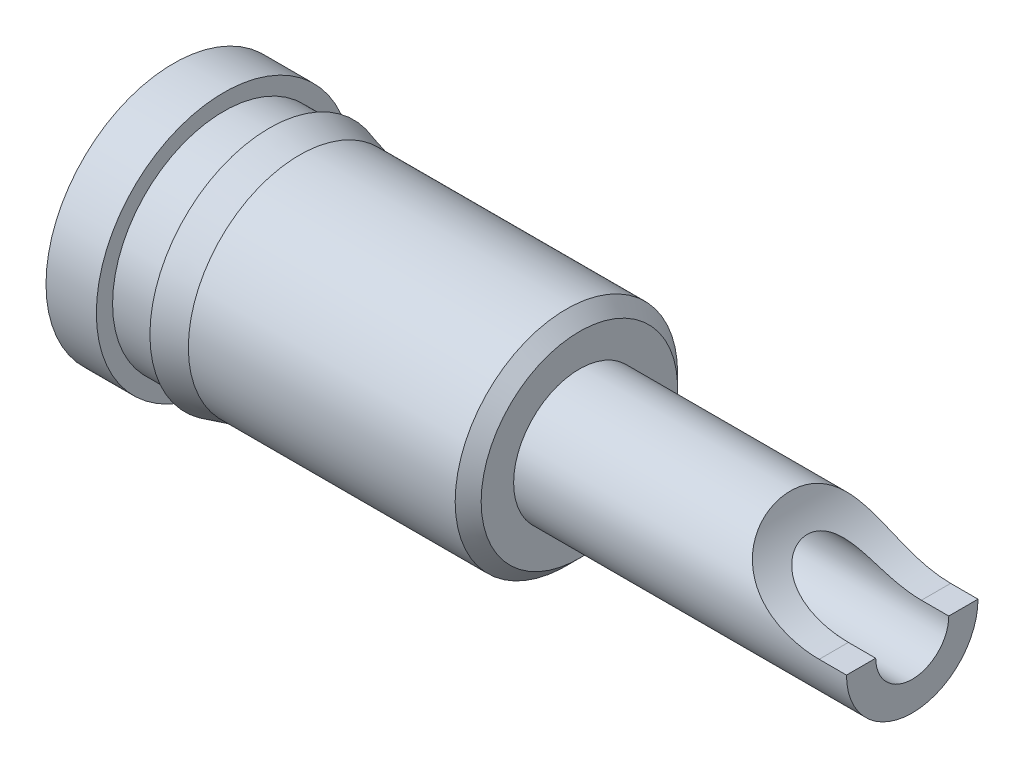
ISO-10303-21;
HEADER;
FILE_DESCRIPTION(('STEP AP214'),'2;1');
FILE_NAME('part.step','',(''),(''),'','','');
FILE_SCHEMA(('AUTOMOTIVE_DESIGN { 1 0 10303 214 1 1 1 1 }'));
ENDSEC;
DATA;
#1=APPLICATION_CONTEXT('core data for automotive mechanical design processes');
#2=APPLICATION_PROTOCOL_DEFINITION('international standard','automotive_design',2000,#1);
#3=PRODUCT_CONTEXT('',#1,'mechanical');
#4=PRODUCT('Part','Part','',(#3));
#5=PRODUCT_RELATED_PRODUCT_CATEGORY('part','',(#4));
#6=PRODUCT_DEFINITION_FORMATION('','',#4);
#7=PRODUCT_DEFINITION_CONTEXT('part definition',#1,'design');
#8=PRODUCT_DEFINITION('design','',#6,#7);
#9=PRODUCT_DEFINITION_SHAPE('','',#8);
#10=(LENGTH_UNIT() NAMED_UNIT(*) SI_UNIT(.MILLI.,.METRE.));
#11=(NAMED_UNIT(*) PLANE_ANGLE_UNIT() SI_UNIT($,.RADIAN.));
#12=(NAMED_UNIT(*) SI_UNIT($,.STERADIAN.) SOLID_ANGLE_UNIT());
#13=UNCERTAINTY_MEASURE_WITH_UNIT(LENGTH_MEASURE(1.E-05),#10,'distance_accuracy_value','');
#14=(GEOMETRIC_REPRESENTATION_CONTEXT(3) GLOBAL_UNCERTAINTY_ASSIGNED_CONTEXT((#13)) GLOBAL_UNIT_ASSIGNED_CONTEXT((#10,
#11,#12)) REPRESENTATION_CONTEXT('',''));
#15=CARTESIAN_POINT('',(0.,0.,0.));
#16=DIRECTION('',(0.,0.,1.));
#17=DIRECTION('',(1.,0.,0.));
#18=AXIS2_PLACEMENT_3D('',#15,#16,#17);
#19=CARTESIAN_POINT('',(11.557,1.02870000000005,0.));
#20=DIRECTION('',(-1.,0.,0.));
#21=DIRECTION('',(0.,0.,1.));
#22=AXIS2_PLACEMENT_3D('',#19,#20,#21);
#23=PLANE('',#22);
#24=DIRECTION('',(0.,0.,-1.));
#25=VECTOR('',#24,1.);
#26=CARTESIAN_POINT('',(11.557,0.,1.0287));
#27=LINE('',#26,#25);
#28=CARTESIAN_POINT('',(11.557,0.,1.0287));
#29=VERTEX_POINT('',#28);
#30=CARTESIAN_POINT('',(11.557,0.,0.571499999999999));
#31=VERTEX_POINT('',#30);
#32=EDGE_CURVE('E64',#29,#31,#27,.T.);
#33=ORIENTED_EDGE('',*,*,#32,.F.);
#34=CARTESIAN_POINT('',(11.557,0.,0.));
#35=DIRECTION('',(-1.,0.,0.));
#36=DIRECTION('',(0.,0.,1.));
#37=AXIS2_PLACEMENT_3D('',#34,#35,#36);
#38=CIRCLE('',#37,1.02870000000005);
#39=CARTESIAN_POINT('',(11.557,0.,-1.0287));
#40=VERTEX_POINT('',#39);
#41=EDGE_CURVE('E115',#40,#29,#38,.T.);
#42=ORIENTED_EDGE('',*,*,#41,.F.);
#43=CARTESIAN_POINT('',(11.557,0.,-0.571499999999999));
#44=VERTEX_POINT('',#43);
#45=EDGE_CURVE('E70',#44,#40,#27,.T.);
#46=ORIENTED_EDGE('',*,*,#45,.F.);
#47=CARTESIAN_POINT('',(11.557,0.,0.));
#48=DIRECTION('',(1.,0.,0.));
#49=DIRECTION('',(0.,0.,-1.));
#50=AXIS2_PLACEMENT_3D('',#47,#48,#49);
#51=CIRCLE('',#50,0.571499999999999);
#52=EDGE_CURVE('E78',#31,#44,#51,.T.);
#53=ORIENTED_EDGE('',*,*,#52,.F.);
#54=EDGE_LOOP('',(#33,#42,#46,#53));
#55=FACE_BOUND('',#54,.T.);
#56=ADVANCED_FACE('F15',(#55),#23,.F.);
#57=CARTESIAN_POINT('',(11.557,0.,0.));
#58=DIRECTION('',(1.,0.,0.));
#59=DIRECTION('',(0.,0.,-1.));
#60=AXIS2_PLACEMENT_3D('',#57,#58,#59);
#61=CYLINDRICAL_SURFACE('',#60,0.571499999999999);
#62=CARTESIAN_POINT('',(7.74700000000005,0.,0.));
#63=DIRECTION('',(1.,0.,0.));
#64=DIRECTION('',(0.,0.,-1.));
#65=AXIS2_PLACEMENT_3D('',#62,#63,#64);
#66=CIRCLE('',#65,0.571499999999999);
#67=CARTESIAN_POINT('',(7.74700000000005,0.,-0.571499999999999));
#68=VERTEX_POINT('',#67);
#69=EDGE_CURVE('E81',#68,#68,#66,.T.);
#70=ORIENTED_EDGE('',*,*,#69,.F.);
#71=EDGE_LOOP('',(#70));
#72=FACE_BOUND('',#71,.T.);
#73=DIRECTION('',(1.,0.,0.));
#74=VECTOR('',#73,1.);
#75=CARTESIAN_POINT('',(11.557,0.,0.571499999999999));
#76=LINE('',#75,#74);
#77=CARTESIAN_POINT('',(11.1295354566527,0.,0.571499999999999));
#78=VERTEX_POINT('',#77);
#79=EDGE_CURVE('E9',#31,#78,#76,.F.);
#80=ORIENTED_EDGE('',*,*,#79,.F.);
#81=ORIENTED_EDGE('',*,*,#52,.T.);
#82=DIRECTION('',(1.,0.,0.));
#83=VECTOR('',#82,1.);
#84=CARTESIAN_POINT('',(11.557,0.,-0.571499999999999));
#85=LINE('',#84,#83);
#86=CARTESIAN_POINT('',(11.1295354566527,0.,-0.571499999999999));
#87=VERTEX_POINT('',#86);
#88=EDGE_CURVE('E107',#87,#44,#85,.T.);
#89=ORIENTED_EDGE('',*,*,#88,.F.);
#90=CARTESIAN_POINT('',(11.1295354566527,0.,0.571499999999999));
#91=CARTESIAN_POINT('',(11.0855159952921,-4.4744006809701E-06,0.571462297699825));
#92=CARTESIAN_POINT('',(11.0414975479188,0.00184555206002953,0.571498895590112));
#93=CARTESIAN_POINT('',(10.9537380661115,0.00922436356428476,0.571447504538728));
#94=CARTESIAN_POINT('',(10.9099972555969,0.0147558110484824,0.571359425377373));
#95=CARTESIAN_POINT('',(10.8227651192155,0.0295294493907641,0.570782321803832));
#96=CARTESIAN_POINT('',(10.7792790461637,0.0388026795307228,0.570289907028761));
#97=CARTESIAN_POINT('',(10.6932897033475,0.0609785542695447,0.568346429134649));
#98=CARTESIAN_POINT('',(10.6507859324396,0.0738793019060474,0.566895866532907));
#99=CARTESIAN_POINT('',(10.5516928540026,0.108591227673722,0.561459468759252));
#100=CARTESIAN_POINT('',(10.4956664453842,0.131934697899569,0.556737919798593));
#101=CARTESIAN_POINT('',(10.3874262216388,0.184528480579718,0.541579004307641));
#102=CARTESIAN_POINT('',(10.3351976698533,0.213754097387136,0.531165232383577));
#103=CARTESIAN_POINT('',(10.2524172516756,0.266281283743967,0.506210635996216));
#104=CARTESIAN_POINT('',(10.2203712943666,0.288384991175211,0.494141143265223));
#105=CARTESIAN_POINT('',(10.1595304109621,0.333626578033216,0.464790873155182));
#106=CARTESIAN_POINT('',(10.1307310027955,0.356762968571085,0.447517404342885));
#107=CARTESIAN_POINT('',(10.0832037978667,0.397538560690939,0.411274590476148));
#108=CARTESIAN_POINT('',(10.063651006333,0.415273025403111,0.393503049918589));
#109=CARTESIAN_POINT('',(10.0276365944709,0.449442804515112,0.35396971516573));
#110=CARTESIAN_POINT('',(10.0111742225108,0.465878434244544,0.33220889376871));
#111=CARTESIAN_POINT('',(9.98170740378967,0.496402121737266,0.284609699739639));
#112=CARTESIAN_POINT('',(9.96873571066148,0.510467509609404,0.258736098603536));
#113=CARTESIAN_POINT('',(9.94686986661818,0.534815410383266,0.203684297055156));
#114=CARTESIAN_POINT('',(9.93797212640678,0.545101251614871,0.174509033901871));
#115=CARTESIAN_POINT('',(9.92551384718245,0.559711385949044,0.118508736044064));
#116=CARTESIAN_POINT('',(9.92135269400524,0.564698731146529,0.0919881703646188));
#117=CARTESIAN_POINT('',(9.91622571053461,0.570861996253648,0.0382072052874944));
#118=CARTESIAN_POINT('',(9.91525828123435,0.572039823474761,0.0109471830097526));
#119=CARTESIAN_POINT('',(9.91648118583563,0.570561826851264,-0.0411966543933377));
#120=CARTESIAN_POINT('',(9.91842455882733,0.568205802045681,-0.0660957497422108));
#121=CARTESIAN_POINT('',(9.92499467111045,0.560353103106829,-0.11502243741864));
#122=CARTESIAN_POINT('',(9.92962088984908,0.554857038238853,-0.139050197850682));
#123=CARTESIAN_POINT('',(9.94149786713899,0.541047596084582,-0.185668201245977));
#124=CARTESIAN_POINT('',(9.94875586102012,0.532726456100992,-0.20825427740888));
#125=CARTESIAN_POINT('',(9.96576257829977,0.513767778909205,-0.25141823253819));
#126=CARTESIAN_POINT('',(9.97551174186403,0.503129832392655,-0.271995755723686));
#127=CARTESIAN_POINT('',(9.99809830615251,0.479294613441481,-0.312207833242896));
#128=CARTESIAN_POINT('',(10.0111069402902,0.465968571009534,-0.331669159891022));
#129=CARTESIAN_POINT('',(10.0394835927516,0.438059214160114,-0.367746857178832));
#130=CARTESIAN_POINT('',(10.0548528653632,0.423475233173528,-0.384361705400457));
#131=CARTESIAN_POINT('',(10.0954357503086,0.386654283876745,-0.422013608650702));
#132=CARTESIAN_POINT('',(10.1218603612936,0.364069227220478,-0.441408773900065));
#133=CARTESIAN_POINT('',(10.1782097595138,0.319299619996963,-0.474809558449723));
#134=CARTESIAN_POINT('',(10.2081417763068,0.297116009467097,-0.488803781079563));
#135=CARTESIAN_POINT('',(10.2857464204056,0.243953174067375,-0.518090037113085));
#136=CARTESIAN_POINT('',(10.3350194505604,0.213884447343276,-0.530760103301918));
#137=CARTESIAN_POINT('',(10.4375723085424,0.158962045170783,-0.549718729972097));
#138=CARTESIAN_POINT('',(10.4908634380841,0.134123885923227,-0.555988510258341));
#139=CARTESIAN_POINT('',(10.5847565970646,0.096624513104441,-0.563496281713784));
#140=CARTESIAN_POINT('',(10.6247192626254,0.0825025227757189,-0.565652882060854));
#141=CARTESIAN_POINT('',(10.7057177915316,0.0575095792861764,-0.56873929540862));
#142=CARTESIAN_POINT('',(10.746754199938,0.0466403135328455,-0.569668472512503));
#143=CARTESIAN_POINT('',(10.8295051098336,0.0282648274266854,-0.570874477643189));
#144=CARTESIAN_POINT('',(10.8712183709073,0.0207530474208849,-0.57115238736513));
#145=CARTESIAN_POINT('',(10.9550941677161,0.00911934411968675,-0.571457187141998));
#146=CARTESIAN_POINT('',(10.9972563878125,0.00499518044446314,-0.5714842432195));
#147=CARTESIAN_POINT('',(11.0545033469406,0.00171664685071382,-0.571497729472845));
#148=CARTESIAN_POINT('',(11.0695136132443,0.00107250117953515,-0.571499107122217));
#149=CARTESIAN_POINT('',(11.0995272334353,0.000214498522681021,-0.571500168466921));
#150=CARTESIAN_POINT('',(11.1145305716241,9.24543091606015E-08,-0.571499854325767));
#151=CARTESIAN_POINT('',(11.1295354566527,0.,-0.571499999999999));
#152=B_SPLINE_CURVE_WITH_KNOTS('',3,(#90,#91,#92,#93,#94,#95,#96,#97,#98,#99,#100,#101,#102,
#103,#104,#105,#106,#107,#108,#109,#110,#111,#112,#113,#114,#115,#116,#117,#118,#119,#120,#121,
#122,#123,#124,#125,#126,#127,#128,#129,#130,#131,#132,#133,#134,#135,#136,#137,#138,#139,#140,
#141,#142,#143,#144,#145,#146,#147,#148,#149,#150,#151),.UNSPECIFIED.,.F.,.F.,(4,2,2,2,2,2,2,2,
2,2,2,2,2,2,2,2,2,2,2,2,2,2,2,2,2,2,2,2,2,2,4),(0.,0.13201779761473,0.264131175726302,
0.397363777558536,0.530526836321833,0.712619040859693,0.893962123746319,1.01586931203037,
1.13760608331221,1.2327093957175,1.32778954766455,1.42373298711741,1.51959173358617,
1.60106328878626,1.68249404730103,1.75739593446608,1.83228329327212,1.90737811458644,
1.9824862136204,2.06297628412015,2.14350927065084,2.26225082666226,2.38124158999529,
2.55754995749366,2.73437418784297,2.86154073755317,2.98877314321881,3.11579407734138,
3.24273093913875,3.28779858952245,3.33280861970517),.UNSPECIFIED.);
#153=EDGE_CURVE('E23',#78,#87,#152,.T.);
#154=ORIENTED_EDGE('',*,*,#153,.F.);
#155=EDGE_LOOP('',(#80,#81,#89,#154));
#156=FACE_BOUND('',#155,.T.);
#157=ADVANCED_FACE('F99',(#72,#156),#61,.F.);
#158=CARTESIAN_POINT('',(0.787400000000021,1.99390000000005,0.));
#159=DIRECTION('',(-1.,0.,0.));
#160=DIRECTION('',(0.,0.,1.));
#161=AXIS2_PLACEMENT_3D('',#158,#159,#160);
#162=PLANE('',#161);
#163=CARTESIAN_POINT('',(0.787400000000021,0.,0.));
#164=DIRECTION('',(-1.,0.,0.));
#165=DIRECTION('',(0.,0.,1.));
#166=AXIS2_PLACEMENT_3D('',#163,#164,#165);
#167=CIRCLE('',#166,1.99390000000005);
#168=CARTESIAN_POINT('',(0.787400000000021,0.,1.99390000000005));
#169=VERTEX_POINT('',#168);
#170=EDGE_CURVE('E109',#169,#169,#167,.T.);
#171=ORIENTED_EDGE('',*,*,#170,.F.);
#172=EDGE_LOOP('',(#171));
#173=FACE_BOUND('',#172,.T.);
#174=CARTESIAN_POINT('',(0.787400000000021,0.,0.));
#175=DIRECTION('',(-1.,0.,0.));
#176=DIRECTION('',(0.,0.,1.));
#177=AXIS2_PLACEMENT_3D('',#174,#175,#176);
#178=CIRCLE('',#177,1.73990000000002);
#179=CARTESIAN_POINT('',(0.787400000000021,0.,1.73990000000002));
#180=VERTEX_POINT('',#179);
#181=EDGE_CURVE('E135',#180,#180,#178,.T.);
#182=ORIENTED_EDGE('',*,*,#181,.T.);
#183=EDGE_LOOP('',(#182));
#184=FACE_BOUND('',#183,.T.);
#185=ADVANCED_FACE('F17',(#173,#184),#162,.F.);
#186=CARTESIAN_POINT('',(0.,0.,0.));
#187=DIRECTION('',(-1.,0.,0.));
#188=DIRECTION('',(0.,0.,1.));
#189=AXIS2_PLACEMENT_3D('',#186,#187,#188);
#190=CYLINDRICAL_SURFACE('',#189,1.99390000000005);
#191=CARTESIAN_POINT('',(0.,0.,0.));
#192=DIRECTION('',(-1.,0.,0.));
#193=DIRECTION('',(0.,0.,1.));
#194=AXIS2_PLACEMENT_3D('',#191,#192,#193);
#195=CIRCLE('',#194,1.99390000000005);
#196=CARTESIAN_POINT('',(0.,0.,1.99390000000005));
#197=VERTEX_POINT('',#196);
#198=EDGE_CURVE('E112',#197,#197,#195,.T.);
#199=ORIENTED_EDGE('',*,*,#198,.F.);
#200=EDGE_LOOP('',(#199));
#201=FACE_BOUND('',#200,.T.);
#202=ORIENTED_EDGE('',*,*,#170,.T.);
#203=EDGE_LOOP('',(#202));
#204=FACE_BOUND('',#203,.T.);
#205=ADVANCED_FACE('F169',(#201,#204),#190,.T.);
#206=CARTESIAN_POINT('',(0.,0.,0.));
#207=DIRECTION('',(1.,0.,0.));
#208=DIRECTION('',(0.,0.,-1.));
#209=AXIS2_PLACEMENT_3D('',#206,#207,#208);
#210=PLANE('',#209);
#211=CARTESIAN_POINT('',(0.,0.,0.));
#212=DIRECTION('',(-1.,0.,0.));
#213=DIRECTION('',(0.,0.,1.));
#214=AXIS2_PLACEMENT_3D('',#211,#212,#213);
#215=CIRCLE('',#214,1.4859);
#216=CARTESIAN_POINT('',(0.,0.,1.4859));
#217=VERTEX_POINT('',#216);
#218=EDGE_CURVE('E144',#217,#217,#215,.T.);
#219=ORIENTED_EDGE('',*,*,#218,.F.);
#220=EDGE_LOOP('',(#219));
#221=FACE_BOUND('',#220,.T.);
#222=ORIENTED_EDGE('',*,*,#198,.T.);
#223=EDGE_LOOP('',(#222));
#224=FACE_BOUND('',#223,.T.);
#225=ADVANCED_FACE('F167',(#221,#224),#210,.F.);
#226=CARTESIAN_POINT('',(0.,0.,0.));
#227=DIRECTION('',(-1.,0.,0.));
#228=DIRECTION('',(0.,0.,1.));
#229=AXIS2_PLACEMENT_3D('',#226,#227,#228);
#230=CYLINDRICAL_SURFACE('',#229,1.02870000000005);
#231=CARTESIAN_POINT('',(6.35000000000004,0.,0.));
#232=DIRECTION('',(-1.,0.,0.));
#233=DIRECTION('',(0.,0.,1.));
#234=AXIS2_PLACEMENT_3D('',#231,#232,#233);
#235=CIRCLE('',#234,1.02870000000005);
#236=CARTESIAN_POINT('',(6.35000000000004,0.,1.02870000000005));
#237=VERTEX_POINT('',#236);
#238=EDGE_CURVE('E117',#237,#237,#235,.T.);
#239=ORIENTED_EDGE('',*,*,#238,.F.);
#240=EDGE_LOOP('',(#239));
#241=FACE_BOUND('',#240,.T.);
#242=ORIENTED_EDGE('',*,*,#41,.T.);
#243=DIRECTION('',(1.,0.,0.));
#244=VECTOR('',#243,1.);
#245=CARTESIAN_POINT('',(11.1295354566527,0.,1.0287));
#246=LINE('',#245,#244);
#247=CARTESIAN_POINT('',(11.1295354566527,0.,1.0287));
#248=VERTEX_POINT('',#247);
#249=EDGE_CURVE('E74',#248,#29,#246,.T.);
#250=ORIENTED_EDGE('',*,*,#249,.F.);
#251=CARTESIAN_POINT('',(11.1295354566527,0.,-1.02870000000005));
#252=CARTESIAN_POINT('',(11.0860148751361,-3.45259687090972E-06,-1.02868017110308));
#253=CARTESIAN_POINT('',(11.0424972163819,0.00180426013157084,-1.02869950196848));
#254=CARTESIAN_POINT('',(10.9557578191185,0.00901329478088549,-1.02867206055866));
#255=CARTESIAN_POINT('',(10.9125360993635,0.0144148423573901,-1.02862528413237));
#256=CARTESIAN_POINT('',(10.8263973596815,0.0288308223766421,-1.0283201556347));
#257=CARTESIAN_POINT('',(10.7834843056379,0.0378691552116431,-1.0280603918873));
#258=CARTESIAN_POINT('',(10.6985850841207,0.0594777766374606,-1.02703530794562));
#259=CARTESIAN_POINT('',(10.6565988878238,0.0720479552285911,-1.02627000349545));
#260=CARTESIAN_POINT('',(10.5314150431117,0.115324910843181,-1.02263718713963));
#261=CARTESIAN_POINT('',(10.4499881862303,0.151432011026498,-1.01842014636579));
#262=CARTESIAN_POINT('',(10.3339593578434,0.215018384160723,-1.00620302728078));
#263=CARTESIAN_POINT('',(10.2963510047028,0.23774566442418,-1.00116010755079));
#264=CARTESIAN_POINT('',(10.2234684159246,0.28602410301148,-0.98845291752041));
#265=CARTESIAN_POINT('',(10.1881928488192,0.311573627871233,-0.980790158210302));
#266=CARTESIAN_POINT('',(10.1092275567231,0.373862260099592,-0.959095943308512));
#267=CARTESIAN_POINT('',(10.0665858807167,0.411517976837252,-0.943798786895749));
#268=CARTESIAN_POINT('',(9.98724144469914,0.489331062568229,-0.905894641041528));
#269=CARTESIAN_POINT('',(9.95053408544543,0.529486460488512,-0.883293353624275));
#270=CARTESIAN_POINT('',(9.88361799826455,0.610200865894949,-0.829601151490013));
#271=CARTESIAN_POINT('',(9.85345562781283,0.650760751403806,-0.798453003798878));
#272=CARTESIAN_POINT('',(9.80026199356828,0.729061188639849,-0.727648623348573));
#273=CARTESIAN_POINT('',(9.77722935162668,0.76680228415672,-0.687994037362815));
#274=CARTESIAN_POINT('',(9.74005703871188,0.832760456067384,-0.605965195304432));
#275=CARTESIAN_POINT('',(9.72521449461846,0.861569550231688,-0.564380001530632));
#276=CARTESIAN_POINT('',(9.70017187296731,0.913180617436243,-0.476368096032727));
#277=CARTESIAN_POINT('',(9.68997186030065,0.935982506508814,-0.429941316646429));
#278=CARTESIAN_POINT('',(9.67357441053609,0.974296228170885,-0.334081028572806));
#279=CARTESIAN_POINT('',(9.6673376538753,0.989879245678867,-0.284682555346248));
#280=CARTESIAN_POINT('',(9.65812001853618,1.01346881241355,-0.183816450452003));
#281=CARTESIAN_POINT('',(9.65513954069183,1.02147442887839,-0.132348564856796));
#282=CARTESIAN_POINT('',(9.6520616360826,1.02974252017914,-0.0270457010375406));
#283=CARTESIAN_POINT('',(9.65205956154868,1.0297489023528,0.026812308184661));
#284=CARTESIAN_POINT('',(9.65517689636858,1.02137328348122,0.133788248698317));
#285=CARTESIAN_POINT('',(9.65829674151514,1.01299011132742,0.186906075617182));
#286=CARTESIAN_POINT('',(9.66806536717445,0.988045904356298,0.291371913971243));
#287=CARTESIAN_POINT('',(9.67474595078822,0.971411265056737,0.342699462256263));
#288=CARTESIAN_POINT('',(9.69232435859256,0.930666120137333,0.441517588225918));
#289=CARTESIAN_POINT('',(9.70322094479839,0.906557809495021,0.489009287323542));
#290=CARTESIAN_POINT('',(9.72973097952043,0.852706877589944,0.577707130754378));
#291=CARTESIAN_POINT('',(9.74523360074912,0.823102177220971,0.619030003924726));
#292=CARTESIAN_POINT('',(9.78166257472921,0.759589604033904,0.695497092111123));
#293=CARTESIAN_POINT('',(9.80258704059221,0.725683230357733,0.730643449526044));
#294=CARTESIAN_POINT('',(9.84951084961344,0.656525123148859,0.793297561787221));
#295=CARTESIAN_POINT('',(9.87536230613145,0.621332196971963,0.820981849105099));
#296=CARTESIAN_POINT('',(9.93230691556719,0.550741594241556,0.869916666211495));
#297=CARTESIAN_POINT('',(9.96340106079514,0.515343880153938,0.891165975886329));
#298=CARTESIAN_POINT('',(10.0321750333676,0.444146935953932,0.928800271687568));
#299=CARTESIAN_POINT('',(10.0701235861179,0.408433334658467,0.944852134876862));
#300=CARTESIAN_POINT('',(10.1505038765195,0.340181768923615,0.971516878035679));
#301=CARTESIAN_POINT('',(10.1929387960272,0.307646090247362,0.982125866131098));
#302=CARTESIAN_POINT('',(10.3018540841868,0.232757755375336,1.00308826765202));
#303=CARTESIAN_POINT('',(10.3704191328746,0.192769810335562,1.01108126104152));
#304=CARTESIAN_POINT('',(10.5132447651447,0.123416025278836,1.02187749892621));
#305=CARTESIAN_POINT('',(10.5875195828219,0.0940778483828626,1.02466730457075));
#306=CARTESIAN_POINT('',(10.7012695332872,0.0588355357631515,1.02707986516253));
#307=CARTESIAN_POINT('',(10.7394321093695,0.0485706538101879,1.02759002152209));
#308=CARTESIAN_POINT('',(10.8164328290011,0.0309346380846429,1.02827322024682));
#309=CARTESIAN_POINT('',(10.8552709897578,0.0235635781317533,1.02844625401264));
#310=CARTESIAN_POINT('',(10.9332383483382,0.0117865945430489,1.0286500280472));
#311=CARTESIAN_POINT('',(10.9723658382439,0.00736930657300583,1.02868131638341));
#312=CARTESIAN_POINT('',(11.0508402349098,0.001474743494675,1.02869967536236));
#313=CARTESIAN_POINT('',(11.0901871338412,-2.63584809431351E-06,1.02868674757282));
#314=CARTESIAN_POINT('',(11.1295354566527,0.,1.02870000000005));
#315=B_SPLINE_CURVE_WITH_KNOTS('',3,(#251,#252,#253,#254,#255,#256,#257,#258,#259,#260,#261,
#262,#263,#264,#265,#266,#267,#268,#269,#270,#271,#272,#273,#274,#275,#276,#277,#278,#279,#280,
#281,#282,#283,#284,#285,#286,#287,#288,#289,#290,#291,#292,#293,#294,#295,#296,#297,#298,#299,
#300,#301,#302,#303,#304,#305,#306,#307,#308,#309,#310,#311,#312,#313,#314),.UNSPECIFIED.,.F.,
.F.,(4,2,2,2,2,2,2,2,2,2,2,2,2,2,2,2,2,2,2,2,2,2,2,2,2,2,2,2,2,2,2,4),(0.,0.130518693056065,
0.261045582108673,0.392444661785374,0.523839649478271,0.789623288867589,0.922137330738708,
1.05457507381559,1.23056732464534,1.40642251635625,1.58348531604767,1.76051386878638,
1.91791384996835,2.07531603114349,2.23113118428912,2.38696551545323,2.54778870424966,
2.70863434569167,2.87094128028231,3.03320059127802,3.19183458140403,3.35041343834709,
3.50482310623002,3.6592620328876,3.82222309182463,3.98530051262286,4.2233608753276,
4.46203525600488,4.58050951029213,4.69898678659137,4.81700556999649,4.93502016897023),.UNSPECIFIED.);
#316=CARTESIAN_POINT('',(11.1295354566527,0.,-1.0287));
#317=VERTEX_POINT('',#316);
#318=EDGE_CURVE('E59',#317,#248,#315,.T.);
#319=ORIENTED_EDGE('',*,*,#318,.F.);
#320=DIRECTION('',(1.,0.,0.));
#321=VECTOR('',#320,1.);
#322=CARTESIAN_POINT('',(11.1295354566527,0.,-1.0287));
#323=LINE('',#322,#321);
#324=EDGE_CURVE('E67',#317,#40,#323,.T.);
#325=ORIENTED_EDGE('',*,*,#324,.T.);
#326=EDGE_LOOP('',(#242,#250,#319,#325));
#327=FACE_BOUND('',#326,.T.);
#328=ADVANCED_FACE('F77',(#241,#327),#230,.T.);
#329=CARTESIAN_POINT('',(6.35000000000004,1.53670000000009,0.));
#330=DIRECTION('',(-1.,0.,0.));
#331=DIRECTION('',(0.,0.,1.));
#332=AXIS2_PLACEMENT_3D('',#329,#330,#331);
#333=PLANE('',#332);
#334=CARTESIAN_POINT('',(6.35000000000004,0.,0.));
#335=DIRECTION('',(-1.,0.,0.));
#336=DIRECTION('',(0.,0.,1.));
#337=AXIS2_PLACEMENT_3D('',#334,#335,#336);
#338=CIRCLE('',#337,1.53670000000009);
#339=CARTESIAN_POINT('',(6.35000000000004,0.,1.53670000000009));
#340=VERTEX_POINT('',#339);
#341=EDGE_CURVE('E120',#340,#340,#338,.T.);
#342=ORIENTED_EDGE('',*,*,#341,.F.);
#343=EDGE_LOOP('',(#342));
#344=FACE_BOUND('',#343,.T.);
#345=ORIENTED_EDGE('',*,*,#238,.T.);
#346=EDGE_LOOP('',(#345));
#347=FACE_BOUND('',#346,.T.);
#348=ADVANCED_FACE('F211',(#344,#347),#333,.F.);
#349=CARTESIAN_POINT('',(6.35000000000004,0.,0.));
#350=DIRECTION('',(-1.,0.,0.));
#351=DIRECTION('',(0.,0.,1.));
#352=AXIS2_PLACEMENT_3D('',#349,#350,#351);
#353=CONICAL_SURFACE('',#352,1.53670000000009,0.785398163397278);
#354=CARTESIAN_POINT('',(6.14680000000004,0.,0.));
#355=DIRECTION('',(-1.,0.,0.));
#356=DIRECTION('',(0.,0.,1.));
#357=AXIS2_PLACEMENT_3D('',#354,#355,#356);
#358=CIRCLE('',#357,1.73990000000002);
#359=CARTESIAN_POINT('',(6.14680000000004,0.,1.73990000000002));
#360=VERTEX_POINT('',#359);
#361=EDGE_CURVE('E123',#360,#360,#358,.T.);
#362=ORIENTED_EDGE('',*,*,#361,.F.);
#363=EDGE_LOOP('',(#362));
#364=FACE_BOUND('',#363,.T.);
#365=ORIENTED_EDGE('',*,*,#341,.T.);
#366=EDGE_LOOP('',(#365));
#367=FACE_BOUND('',#366,.T.);
#368=ADVANCED_FACE('F205',(#364,#367),#353,.T.);
#369=CARTESIAN_POINT('',(0.,0.,0.));
#370=DIRECTION('',(-1.,0.,0.));
#371=DIRECTION('',(0.,0.,1.));
#372=AXIS2_PLACEMENT_3D('',#369,#370,#371);
#373=CYLINDRICAL_SURFACE('',#372,1.73990000000002);
#374=CARTESIAN_POINT('',(1.97257045256134,0.,0.));
#375=DIRECTION('',(-1.,0.,0.));
#376=DIRECTION('',(0.,0.,1.));
#377=AXIS2_PLACEMENT_3D('',#374,#375,#376);
#378=CIRCLE('',#377,1.73990000000002);
#379=CARTESIAN_POINT('',(1.97257045256134,0.,1.73990000000002));
#380=VERTEX_POINT('',#379);
#381=EDGE_CURVE('E126',#380,#380,#378,.T.);
#382=ORIENTED_EDGE('',*,*,#381,.F.);
#383=EDGE_LOOP('',(#382));
#384=FACE_BOUND('',#383,.T.);
#385=ORIENTED_EDGE('',*,*,#361,.T.);
#386=EDGE_LOOP('',(#385));
#387=FACE_BOUND('',#386,.T.);
#388=ADVANCED_FACE('F199',(#384,#387),#373,.T.);
#389=CARTESIAN_POINT('',(1.97257045256134,0.,0.));
#390=DIRECTION('',(-1.,0.,0.));
#391=DIRECTION('',(0.,0.,1.));
#392=AXIS2_PLACEMENT_3D('',#389,#390,#391);
#393=CONICAL_SURFACE('',#392,1.73990000000002,0.261799387799154);
#394=CARTESIAN_POINT('',(1.49860000000004,0.,0.));
#395=DIRECTION('',(-1.,0.,0.));
#396=DIRECTION('',(0.,0.,1.));
#397=AXIS2_PLACEMENT_3D('',#394,#395,#396);
#398=CIRCLE('',#397,1.86690000000003);
#399=CARTESIAN_POINT('',(1.49860000000004,0.,1.86690000000003));
#400=VERTEX_POINT('',#399);
#401=EDGE_CURVE('E129',#400,#400,#398,.T.);
#402=ORIENTED_EDGE('',*,*,#401,.F.);
#403=EDGE_LOOP('',(#402));
#404=FACE_BOUND('',#403,.T.);
#405=ORIENTED_EDGE('',*,*,#381,.T.);
#406=EDGE_LOOP('',(#405));
#407=FACE_BOUND('',#406,.T.);
#408=ADVANCED_FACE('F193',(#404,#407),#393,.T.);
#409=CARTESIAN_POINT('',(1.49860000000004,1.73990000000002,0.));
#410=DIRECTION('',(1.,0.,0.));
#411=DIRECTION('',(0.,0.,-1.));
#412=AXIS2_PLACEMENT_3D('',#409,#410,#411);
#413=PLANE('',#412);
#414=CARTESIAN_POINT('',(1.49860000000003,0.,0.));
#415=DIRECTION('',(-1.,0.,0.));
#416=DIRECTION('',(0.,0.,1.));
#417=AXIS2_PLACEMENT_3D('',#414,#415,#416);
#418=CIRCLE('',#417,1.73990000000002);
#419=CARTESIAN_POINT('',(1.49860000000003,0.,1.73990000000002));
#420=VERTEX_POINT('',#419);
#421=EDGE_CURVE('E132',#420,#420,#418,.T.);
#422=ORIENTED_EDGE('',*,*,#421,.F.);
#423=EDGE_LOOP('',(#422));
#424=FACE_BOUND('',#423,.T.);
#425=ORIENTED_EDGE('',*,*,#401,.T.);
#426=EDGE_LOOP('',(#425));
#427=FACE_BOUND('',#426,.T.);
#428=ADVANCED_FACE('F187',(#424,#427),#413,.F.);
#429=CARTESIAN_POINT('',(0.,0.,0.));
#430=DIRECTION('',(-1.,0.,0.));
#431=DIRECTION('',(0.,0.,1.));
#432=AXIS2_PLACEMENT_3D('',#429,#430,#431);
#433=CYLINDRICAL_SURFACE('',#432,1.73990000000002);
#434=ORIENTED_EDGE('',*,*,#181,.F.);
#435=EDGE_LOOP('',(#434));
#436=FACE_BOUND('',#435,.T.);
#437=ORIENTED_EDGE('',*,*,#421,.T.);
#438=EDGE_LOOP('',(#437));
#439=FACE_BOUND('',#438,.T.);
#440=ADVANCED_FACE('F183',(#436,#439),#433,.T.);
#441=CARTESIAN_POINT('',(5.588,0.,0.));
#442=DIRECTION('',(-1.,0.,0.));
#443=DIRECTION('',(0.,0.,1.));
#444=AXIS2_PLACEMENT_3D('',#441,#442,#443);
#445=CONICAL_SURFACE('',#444,1.3589,1.02974425867665);
#446=CARTESIAN_POINT('',(6.40450949519655,0.,0.));
#447=VERTEX_POINT('',#446);
#448=VERTEX_LOOP('',#447);
#449=FACE_BOUND('',#448,.T.);
#450=CARTESIAN_POINT('',(5.588,0.,0.));
#451=DIRECTION('',(-1.,0.,0.));
#452=DIRECTION('',(0.,0.,1.));
#453=AXIS2_PLACEMENT_3D('',#450,#451,#452);
#454=CIRCLE('',#453,1.3589);
#455=CARTESIAN_POINT('',(5.588,0.,1.3589));
#456=VERTEX_POINT('',#455);
#457=EDGE_CURVE('E138',#456,#456,#454,.T.);
#458=ORIENTED_EDGE('',*,*,#457,.T.);
#459=EDGE_LOOP('',(#458));
#460=FACE_BOUND('',#459,.T.);
#461=ADVANCED_FACE('F186',(#449,#460),#445,.F.);
#462=CARTESIAN_POINT('',(0.,0.,0.));
#463=DIRECTION('',(-1.,0.,0.));
#464=DIRECTION('',(0.,0.,1.));
#465=AXIS2_PLACEMENT_3D('',#462,#463,#464);
#466=CYLINDRICAL_SURFACE('',#465,1.3589);
#467=ORIENTED_EDGE('',*,*,#457,.F.);
#468=EDGE_LOOP('',(#467));
#469=FACE_BOUND('',#468,.T.);
#470=CARTESIAN_POINT('',(0.219970452561224,0.,0.));
#471=DIRECTION('',(-1.,0.,0.));
#472=DIRECTION('',(0.,0.,1.));
#473=AXIS2_PLACEMENT_3D('',#470,#471,#472);
#474=CIRCLE('',#473,1.3589);
#475=CARTESIAN_POINT('',(0.219970452561224,0.,1.3589));
#476=VERTEX_POINT('',#475);
#477=EDGE_CURVE('E141',#476,#476,#474,.T.);
#478=ORIENTED_EDGE('',*,*,#477,.T.);
#479=EDGE_LOOP('',(#478));
#480=FACE_BOUND('',#479,.T.);
#481=ADVANCED_FACE('F263',(#469,#480),#466,.F.);
#482=CARTESIAN_POINT('',(0.,0.,0.));
#483=DIRECTION('',(-1.,0.,0.));
#484=DIRECTION('',(0.,0.,1.));
#485=AXIS2_PLACEMENT_3D('',#482,#483,#484);
#486=CONICAL_SURFACE('',#485,1.4859,0.523598775598336);
#487=ORIENTED_EDGE('',*,*,#477,.F.);
#488=EDGE_LOOP('',(#487));
#489=FACE_BOUND('',#488,.T.);
#490=ORIENTED_EDGE('',*,*,#218,.T.);
#491=EDGE_LOOP('',(#490));
#492=FACE_BOUND('',#491,.T.);
#493=ADVANCED_FACE('F271',(#489,#492),#486,.F.);
#494=CARTESIAN_POINT('',(7.74700000000005,0.,0.));
#495=DIRECTION('',(1.,0.,0.));
#496=DIRECTION('',(0.,0.,-1.));
#497=AXIS2_PLACEMENT_3D('',#494,#495,#496);
#498=CONICAL_SURFACE('',#497,0.571499999999999,1.02974425867665);
#499=CARTESIAN_POINT('',(7.40360815622579,0.,0.));
#500=VERTEX_POINT('',#499);
#501=VERTEX_LOOP('',#500);
#502=FACE_BOUND('',#501,.T.);
#503=ORIENTED_EDGE('',*,*,#69,.T.);
#504=EDGE_LOOP('',(#503));
#505=FACE_BOUND('',#504,.T.);
#506=ADVANCED_FACE('F98',(#502,#505),#498,.F.);
#507=CARTESIAN_POINT('',(11.1295354566527,1.5748,1.0287));
#508=DIRECTION('',(0.,0.,-1.));
#509=DIRECTION('',(-1.,0.,0.));
#510=AXIS2_PLACEMENT_3D('',#507,#508,#509);
#511=CYLINDRICAL_SURFACE('',#510,1.5748);
#512=ORIENTED_EDGE('',*,*,#318,.T.);
#513=DIRECTION('',(0.,0.,-1.));
#514=VECTOR('',#513,1.);
#515=CARTESIAN_POINT('',(11.1295354566527,0.,1.0287));
#516=LINE('',#515,#514);
#517=EDGE_CURVE('E63',#248,#78,#516,.T.);
#518=ORIENTED_EDGE('',*,*,#517,.T.);
#519=ORIENTED_EDGE('',*,*,#153,.T.);
#520=EDGE_CURVE('E30',#87,#317,#516,.T.);
#521=ORIENTED_EDGE('',*,*,#520,.T.);
#522=EDGE_LOOP('',(#512,#518,#519,#521));
#523=FACE_BOUND('',#522,.T.);
#524=ADVANCED_FACE('F56',(#523),#511,.F.);
#525=CARTESIAN_POINT('',(11.1295354566527,0.,1.0287));
#526=DIRECTION('',(0.,1.,0.));
#527=DIRECTION('',(0.,0.,1.));
#528=AXIS2_PLACEMENT_3D('',#525,#526,#527);
#529=PLANE('',#528);
#530=ORIENTED_EDGE('',*,*,#79,.T.);
#531=ORIENTED_EDGE('',*,*,#517,.F.);
#532=ORIENTED_EDGE('',*,*,#249,.T.);
#533=ORIENTED_EDGE('',*,*,#32,.T.);
#534=EDGE_LOOP('',(#530,#531,#532,#533));
#535=FACE_BOUND('',#534,.T.);
#536=ADVANCED_FACE('F97',(#535),#529,.T.);
#537=ORIENTED_EDGE('',*,*,#88,.T.);
#538=ORIENTED_EDGE('',*,*,#45,.T.);
#539=ORIENTED_EDGE('',*,*,#324,.F.);
#540=ORIENTED_EDGE('',*,*,#520,.F.);
#541=EDGE_LOOP('',(#537,#538,#539,#540));
#542=FACE_BOUND('',#541,.T.);
#543=ADVANCED_FACE('F68',(#542),#529,.T.);
#544=CLOSED_SHELL('',(#56,#157,#185,#205,#225,#328,#348,#368,#388,#408,#428,#440,#461,#481,#493,
#506,#524,#536,#543));
#545=MANIFOLD_SOLID_BREP('B1',#544);
#546=ADVANCED_BREP_SHAPE_REPRESENTATION('',(#18,#545),#14);
#547=SHAPE_DEFINITION_REPRESENTATION(#9,#546);
ENDSEC;
END-ISO-10303-21;
